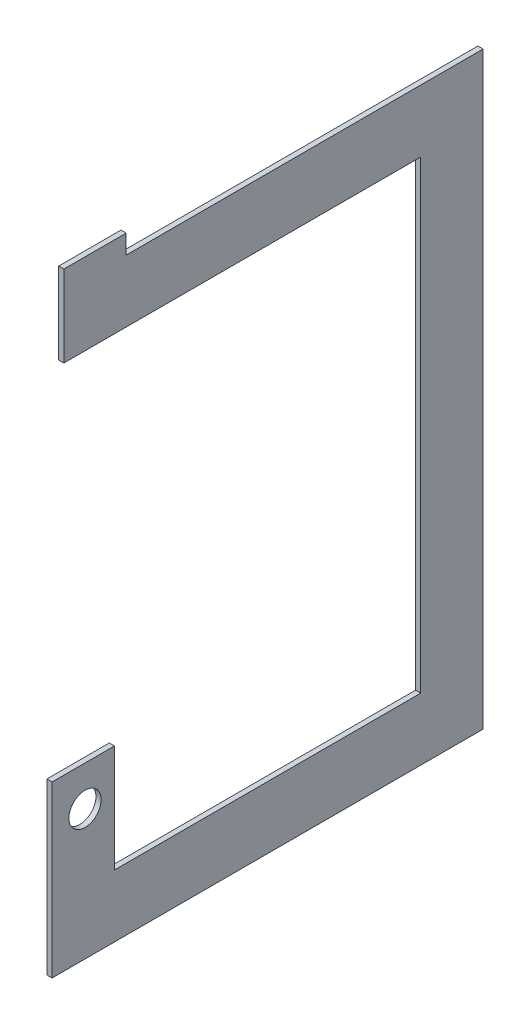
ISO-10303-21;
HEADER;
FILE_DESCRIPTION(('STEP AP214'),'2;1');
FILE_NAME('part.step','',(''),(''),'','','');
FILE_SCHEMA(('AUTOMOTIVE_DESIGN { 1 0 10303 214 1 1 1 1 }'));
ENDSEC;
DATA;
#1=APPLICATION_CONTEXT('core data for automotive mechanical design processes');
#2=APPLICATION_PROTOCOL_DEFINITION('international standard','automotive_design',2000,#1);
#3=PRODUCT_CONTEXT('',#1,'mechanical');
#4=PRODUCT('Part','Part','',(#3));
#5=PRODUCT_RELATED_PRODUCT_CATEGORY('part','',(#4));
#6=PRODUCT_DEFINITION_FORMATION('','',#4);
#7=PRODUCT_DEFINITION_CONTEXT('part definition',#1,'design');
#8=PRODUCT_DEFINITION('design','',#6,#7);
#9=PRODUCT_DEFINITION_SHAPE('','',#8);
#10=(LENGTH_UNIT() NAMED_UNIT(*) SI_UNIT(.MILLI.,.METRE.));
#11=(NAMED_UNIT(*) PLANE_ANGLE_UNIT() SI_UNIT($,.RADIAN.));
#12=(NAMED_UNIT(*) SI_UNIT($,.STERADIAN.) SOLID_ANGLE_UNIT());
#13=UNCERTAINTY_MEASURE_WITH_UNIT(LENGTH_MEASURE(1.E-05),#10,'distance_accuracy_value','');
#14=(GEOMETRIC_REPRESENTATION_CONTEXT(3) GLOBAL_UNCERTAINTY_ASSIGNED_CONTEXT((#13)) GLOBAL_UNIT_ASSIGNED_CONTEXT((#10,
#11,#12)) REPRESENTATION_CONTEXT('',''));
#15=CARTESIAN_POINT('',(0.,0.,0.));
#16=DIRECTION('',(0.,0.,1.));
#17=DIRECTION('',(1.,0.,0.));
#18=AXIS2_PLACEMENT_3D('',#15,#16,#17);
#19=CARTESIAN_POINT('',(0.3,0.,0.));
#20=DIRECTION('',(1.,0.,0.));
#21=DIRECTION('',(0.,0.,-1.));
#22=AXIS2_PLACEMENT_3D('',#19,#20,#21);
#23=PLANE('',#22);
#24=DIRECTION('',(0.,0.,1.));
#25=VECTOR('',#24,1.);
#26=CARTESIAN_POINT('',(0.3,0.,-3.6));
#27=LINE('',#26,#25);
#28=CARTESIAN_POINT('',(0.3,0.,-3.6));
#29=VERTEX_POINT('',#28);
#30=CARTESIAN_POINT('',(0.3,0.,0.));
#31=VERTEX_POINT('',#30);
#32=EDGE_CURVE('E200',#29,#31,#27,.T.);
#33=ORIENTED_EDGE('',*,*,#32,.T.);
#34=DIRECTION('',(0.,-1.,0.));
#35=VECTOR('',#34,1.);
#36=CARTESIAN_POINT('',(0.3,0.,0.));
#37=LINE('',#36,#35);
#38=CARTESIAN_POINT('',(0.3,-9.8,0.));
#39=VERTEX_POINT('',#38);
#40=EDGE_CURVE('E112',#31,#39,#37,.T.);
#41=ORIENTED_EDGE('',*,*,#40,.T.);
#42=DIRECTION('',(0.,0.,-1.));
#43=VECTOR('',#42,1.);
#44=CARTESIAN_POINT('',(0.3,-9.8,0.));
#45=LINE('',#44,#43);
#46=CARTESIAN_POINT('',(0.3,-9.8,-24.8771));
#47=VERTEX_POINT('',#46);
#48=EDGE_CURVE('E237',#39,#47,#45,.T.);
#49=ORIENTED_EDGE('',*,*,#48,.T.);
#50=DIRECTION('',(0.,1.,0.));
#51=VECTOR('',#50,1.);
#52=CARTESIAN_POINT('',(0.3,-9.8,-24.8771));
#53=LINE('',#52,#51);
#54=CARTESIAN_POINT('',(0.3,24.2,-24.8771));
#55=VERTEX_POINT('',#54);
#56=EDGE_CURVE('E257',#47,#55,#53,.T.);
#57=ORIENTED_EDGE('',*,*,#56,.T.);
#58=DIRECTION('',(0.,0.,1.));
#59=VECTOR('',#58,1.);
#60=CARTESIAN_POINT('',(0.3,24.2,-24.8771));
#61=LINE('',#60,#59);
#62=CARTESIAN_POINT('',(0.3,24.2,-4.2771));
#63=VERTEX_POINT('',#62);
#64=EDGE_CURVE('E253',#55,#63,#61,.T.);
#65=ORIENTED_EDGE('',*,*,#64,.T.);
#66=DIRECTION('',(0.,1.,0.));
#67=VECTOR('',#66,1.);
#68=CARTESIAN_POINT('',(0.3,24.2,-4.2771));
#69=LINE('',#68,#67);
#70=CARTESIAN_POINT('',(0.3,25.3,-4.2771));
#71=VERTEX_POINT('',#70);
#72=EDGE_CURVE('E256',#63,#71,#69,.T.);
#73=ORIENTED_EDGE('',*,*,#72,.T.);
#74=DIRECTION('',(0.,0.,1.));
#75=VECTOR('',#74,1.);
#76=CARTESIAN_POINT('',(0.3,25.3,-4.2771));
#77=LINE('',#76,#75);
#78=CARTESIAN_POINT('',(0.3,25.3,-0.6771));
#79=VERTEX_POINT('',#78);
#80=EDGE_CURVE('E261',#71,#79,#77,.T.);
#81=ORIENTED_EDGE('',*,*,#80,.T.);
#82=DIRECTION('',(0.,-1.,0.));
#83=VECTOR('',#82,1.);
#84=CARTESIAN_POINT('',(0.3,25.3,-0.6771));
#85=LINE('',#84,#83);
#86=CARTESIAN_POINT('',(0.3,20.6,-0.677100000000001));
#87=VERTEX_POINT('',#86);
#88=EDGE_CURVE('E268',#79,#87,#85,.T.);
#89=ORIENTED_EDGE('',*,*,#88,.T.);
#90=DIRECTION('',(0.,0.,-1.));
#91=VECTOR('',#90,1.);
#92=CARTESIAN_POINT('',(0.3,20.6,-0.677100000000001));
#93=LINE('',#92,#91);
#94=CARTESIAN_POINT('',(0.3,20.6,-21.2771));
#95=VERTEX_POINT('',#94);
#96=EDGE_CURVE('E143',#87,#95,#93,.T.);
#97=ORIENTED_EDGE('',*,*,#96,.T.);
#98=DIRECTION('',(0.,-1.,0.));
#99=VECTOR('',#98,1.);
#100=CARTESIAN_POINT('',(0.3,20.6,-21.2771));
#101=LINE('',#100,#99);
#102=CARTESIAN_POINT('',(0.3,-6.2,-21.2771));
#103=VERTEX_POINT('',#102);
#104=EDGE_CURVE('E137',#95,#103,#101,.T.);
#105=ORIENTED_EDGE('',*,*,#104,.T.);
#106=DIRECTION('',(0.,0.,1.));
#107=VECTOR('',#106,1.);
#108=CARTESIAN_POINT('',(0.3,-6.2,-21.2771));
#109=LINE('',#108,#107);
#110=CARTESIAN_POINT('',(0.3,-6.2,-3.6));
#111=VERTEX_POINT('',#110);
#112=EDGE_CURVE('E141',#103,#111,#109,.T.);
#113=ORIENTED_EDGE('',*,*,#112,.T.);
#114=DIRECTION('',(0.,1.,0.));
#115=VECTOR('',#114,1.);
#116=CARTESIAN_POINT('',(0.3,-6.2,-3.6));
#117=LINE('',#116,#115);
#118=EDGE_CURVE('E57',#111,#29,#117,.T.);
#119=ORIENTED_EDGE('',*,*,#118,.T.);
#120=EDGE_LOOP('',(#33,#41,#49,#57,#65,#73,#81,#89,#97,#105,#113,#119));
#121=FACE_BOUND('',#120,.T.);
#122=CARTESIAN_POINT('',(0.3,-2.295,-1.9));
#123=DIRECTION('',(1.,0.,0.));
#124=DIRECTION('',(0.,0.,-1.));
#125=AXIS2_PLACEMENT_3D('',#122,#123,#124);
#126=CIRCLE('',#125,0.93);
#127=CARTESIAN_POINT('',(0.3,-2.295,-2.83));
#128=VERTEX_POINT('',#127);
#129=EDGE_CURVE('E170',#128,#128,#126,.T.);
#130=ORIENTED_EDGE('',*,*,#129,.F.);
#131=EDGE_LOOP('',(#130));
#132=FACE_BOUND('',#131,.T.);
#133=ADVANCED_FACE('F39',(#121,#132),#23,.T.);
#134=CARTESIAN_POINT('',(0.,0.,0.));
#135=DIRECTION('',(1.,0.,0.));
#136=DIRECTION('',(0.,0.,-1.));
#137=AXIS2_PLACEMENT_3D('',#134,#135,#136);
#138=PLANE('',#137);
#139=DIRECTION('',(0.,0.,1.));
#140=VECTOR('',#139,1.);
#141=CARTESIAN_POINT('',(0.,0.,-3.6));
#142=LINE('',#141,#140);
#143=CARTESIAN_POINT('',(0.,0.,-3.6));
#144=VERTEX_POINT('',#143);
#145=CARTESIAN_POINT('',(0.,0.,0.));
#146=VERTEX_POINT('',#145);
#147=EDGE_CURVE('E165',#144,#146,#142,.T.);
#148=ORIENTED_EDGE('',*,*,#147,.F.);
#149=DIRECTION('',(0.,1.,0.));
#150=VECTOR('',#149,1.);
#151=CARTESIAN_POINT('',(0.,-6.2,-3.6));
#152=LINE('',#151,#150);
#153=CARTESIAN_POINT('',(0.,-6.2,-3.6));
#154=VERTEX_POINT('',#153);
#155=EDGE_CURVE('E104',#154,#144,#152,.T.);
#156=ORIENTED_EDGE('',*,*,#155,.F.);
#157=DIRECTION('',(0.,0.,1.));
#158=VECTOR('',#157,1.);
#159=CARTESIAN_POINT('',(0.,-6.2,-21.2771));
#160=LINE('',#159,#158);
#161=CARTESIAN_POINT('',(0.,-6.2,-21.2771));
#162=VERTEX_POINT('',#161);
#163=EDGE_CURVE('E98',#162,#154,#160,.T.);
#164=ORIENTED_EDGE('',*,*,#163,.F.);
#165=DIRECTION('',(0.,-1.,0.));
#166=VECTOR('',#165,1.);
#167=CARTESIAN_POINT('',(0.,20.6,-21.2771));
#168=LINE('',#167,#166);
#169=CARTESIAN_POINT('',(0.,20.6,-21.2771));
#170=VERTEX_POINT('',#169);
#171=EDGE_CURVE('E152',#170,#162,#168,.T.);
#172=ORIENTED_EDGE('',*,*,#171,.F.);
#173=DIRECTION('',(0.,0.,-1.));
#174=VECTOR('',#173,1.);
#175=CARTESIAN_POINT('',(0.,20.6,-0.677100000000001));
#176=LINE('',#175,#174);
#177=CARTESIAN_POINT('',(0.,20.6,-0.677100000000001));
#178=VERTEX_POINT('',#177);
#179=EDGE_CURVE('E191',#178,#170,#176,.T.);
#180=ORIENTED_EDGE('',*,*,#179,.F.);
#181=DIRECTION('',(0.,-1.,0.));
#182=VECTOR('',#181,1.);
#183=CARTESIAN_POINT('',(0.,25.3,-0.6771));
#184=LINE('',#183,#182);
#185=CARTESIAN_POINT('',(0.,25.3,-0.6771));
#186=VERTEX_POINT('',#185);
#187=EDGE_CURVE('E188',#186,#178,#184,.T.);
#188=ORIENTED_EDGE('',*,*,#187,.F.);
#189=DIRECTION('',(0.,0.,1.));
#190=VECTOR('',#189,1.);
#191=CARTESIAN_POINT('',(0.,25.3,-4.2771));
#192=LINE('',#191,#190);
#193=CARTESIAN_POINT('',(0.,25.3,-4.2771));
#194=VERTEX_POINT('',#193);
#195=EDGE_CURVE('E185',#194,#186,#192,.T.);
#196=ORIENTED_EDGE('',*,*,#195,.F.);
#197=DIRECTION('',(0.,1.,0.));
#198=VECTOR('',#197,1.);
#199=CARTESIAN_POINT('',(0.,24.2,-4.2771));
#200=LINE('',#199,#198);
#201=CARTESIAN_POINT('',(0.,24.2,-4.2771));
#202=VERTEX_POINT('',#201);
#203=EDGE_CURVE('E182',#202,#194,#200,.T.);
#204=ORIENTED_EDGE('',*,*,#203,.F.);
#205=DIRECTION('',(0.,0.,1.));
#206=VECTOR('',#205,1.);
#207=CARTESIAN_POINT('',(0.,24.2,-24.8771));
#208=LINE('',#207,#206);
#209=CARTESIAN_POINT('',(0.,24.2,-24.8771));
#210=VERTEX_POINT('',#209);
#211=EDGE_CURVE('E179',#210,#202,#208,.T.);
#212=ORIENTED_EDGE('',*,*,#211,.F.);
#213=DIRECTION('',(0.,1.,0.));
#214=VECTOR('',#213,1.);
#215=CARTESIAN_POINT('',(0.,-9.8,-24.8771));
#216=LINE('',#215,#214);
#217=CARTESIAN_POINT('',(0.,-9.8,-24.8771));
#218=VERTEX_POINT('',#217);
#219=EDGE_CURVE('E176',#218,#210,#216,.T.);
#220=ORIENTED_EDGE('',*,*,#219,.F.);
#221=DIRECTION('',(0.,0.,-1.));
#222=VECTOR('',#221,1.);
#223=CARTESIAN_POINT('',(0.,-9.8,0.));
#224=LINE('',#223,#222);
#225=CARTESIAN_POINT('',(0.,-9.8,0.));
#226=VERTEX_POINT('',#225);
#227=EDGE_CURVE('E173',#226,#218,#224,.T.);
#228=ORIENTED_EDGE('',*,*,#227,.F.);
#229=DIRECTION('',(0.,-1.,0.));
#230=VECTOR('',#229,1.);
#231=CARTESIAN_POINT('',(0.,0.,0.));
#232=LINE('',#231,#230);
#233=EDGE_CURVE('E169',#146,#226,#232,.T.);
#234=ORIENTED_EDGE('',*,*,#233,.F.);
#235=EDGE_LOOP('',(#148,#156,#164,#172,#180,#188,#196,#204,#212,#220,#228,#234));
#236=FACE_BOUND('',#235,.T.);
#237=CARTESIAN_POINT('',(0.,-2.295,-1.9));
#238=DIRECTION('',(1.,0.,0.));
#239=DIRECTION('',(0.,0.,-1.));
#240=AXIS2_PLACEMENT_3D('',#237,#238,#239);
#241=CIRCLE('',#240,0.93);
#242=CARTESIAN_POINT('',(0.,-2.295,-2.83));
#243=VERTEX_POINT('',#242);
#244=EDGE_CURVE('E417',#243,#243,#241,.T.);
#245=ORIENTED_EDGE('',*,*,#244,.T.);
#246=EDGE_LOOP('',(#245));
#247=FACE_BOUND('',#246,.T.);
#248=ADVANCED_FACE('F241',(#236,#247),#138,.F.);
#249=CARTESIAN_POINT('',(0.3,0.,-3.6));
#250=DIRECTION('',(0.,-1.,0.));
#251=DIRECTION('',(0.,0.,-1.));
#252=AXIS2_PLACEMENT_3D('',#249,#250,#251);
#253=PLANE('',#252);
#254=ORIENTED_EDGE('',*,*,#147,.T.);
#255=DIRECTION('',(-1.,0.,0.));
#256=VECTOR('',#255,1.);
#257=CARTESIAN_POINT('',(0.3,0.,0.));
#258=LINE('',#257,#256);
#259=EDGE_CURVE('E11',#31,#146,#258,.T.);
#260=ORIENTED_EDGE('',*,*,#259,.F.);
#261=ORIENTED_EDGE('',*,*,#32,.F.);
#262=DIRECTION('',(-1.,0.,0.));
#263=VECTOR('',#262,1.);
#264=CARTESIAN_POINT('',(0.3,0.,-3.6));
#265=LINE('',#264,#263);
#266=EDGE_CURVE('E161',#29,#144,#265,.T.);
#267=ORIENTED_EDGE('',*,*,#266,.T.);
#268=EDGE_LOOP('',(#254,#260,#261,#267));
#269=FACE_BOUND('',#268,.T.);
#270=ADVANCED_FACE('F41',(#269),#253,.F.);
#271=CARTESIAN_POINT('',(0.3,0.,0.));
#272=DIRECTION('',(0.,0.,-1.));
#273=DIRECTION('',(-1.,0.,0.));
#274=AXIS2_PLACEMENT_3D('',#271,#272,#273);
#275=PLANE('',#274);
#276=ORIENTED_EDGE('',*,*,#233,.T.);
#277=DIRECTION('',(-1.,0.,0.));
#278=VECTOR('',#277,1.);
#279=CARTESIAN_POINT('',(0.3,-9.8,0.));
#280=LINE('',#279,#278);
#281=EDGE_CURVE('E49',#39,#226,#280,.T.);
#282=ORIENTED_EDGE('',*,*,#281,.F.);
#283=ORIENTED_EDGE('',*,*,#40,.F.);
#284=ORIENTED_EDGE('',*,*,#259,.T.);
#285=EDGE_LOOP('',(#276,#282,#283,#284));
#286=FACE_BOUND('',#285,.T.);
#287=ADVANCED_FACE('F304',(#286),#275,.F.);
#288=CARTESIAN_POINT('',(0.3,-9.8,0.));
#289=DIRECTION('',(0.,1.,0.));
#290=DIRECTION('',(0.,0.,1.));
#291=AXIS2_PLACEMENT_3D('',#288,#289,#290);
#292=PLANE('',#291);
#293=ORIENTED_EDGE('',*,*,#227,.T.);
#294=DIRECTION('',(-1.,0.,0.));
#295=VECTOR('',#294,1.);
#296=CARTESIAN_POINT('',(0.3,-9.8,-24.8771));
#297=LINE('',#296,#295);
#298=EDGE_CURVE('E227',#47,#218,#297,.T.);
#299=ORIENTED_EDGE('',*,*,#298,.F.);
#300=ORIENTED_EDGE('',*,*,#48,.F.);
#301=ORIENTED_EDGE('',*,*,#281,.T.);
#302=EDGE_LOOP('',(#293,#299,#300,#301));
#303=FACE_BOUND('',#302,.T.);
#304=ADVANCED_FACE('F235',(#303),#292,.F.);
#305=CARTESIAN_POINT('',(0.3,-9.8,-24.8771));
#306=DIRECTION('',(0.,0.,1.));
#307=DIRECTION('',(1.,0.,0.));
#308=AXIS2_PLACEMENT_3D('',#305,#306,#307);
#309=PLANE('',#308);
#310=ORIENTED_EDGE('',*,*,#219,.T.);
#311=DIRECTION('',(-1.,0.,0.));
#312=VECTOR('',#311,1.);
#313=CARTESIAN_POINT('',(0.3,24.2,-24.8771));
#314=LINE('',#313,#312);
#315=EDGE_CURVE('E223',#55,#210,#314,.T.);
#316=ORIENTED_EDGE('',*,*,#315,.F.);
#317=ORIENTED_EDGE('',*,*,#56,.F.);
#318=ORIENTED_EDGE('',*,*,#298,.T.);
#319=EDGE_LOOP('',(#310,#316,#317,#318));
#320=FACE_BOUND('',#319,.T.);
#321=ADVANCED_FACE('F247',(#320),#309,.F.);
#322=CARTESIAN_POINT('',(0.3,24.2,-24.8771));
#323=DIRECTION('',(0.,-1.,0.));
#324=DIRECTION('',(0.,0.,-1.));
#325=AXIS2_PLACEMENT_3D('',#322,#323,#324);
#326=PLANE('',#325);
#327=ORIENTED_EDGE('',*,*,#211,.T.);
#328=DIRECTION('',(-1.,0.,0.));
#329=VECTOR('',#328,1.);
#330=CARTESIAN_POINT('',(0.3,24.2,-4.2771));
#331=LINE('',#330,#329);
#332=EDGE_CURVE('E219',#63,#202,#331,.T.);
#333=ORIENTED_EDGE('',*,*,#332,.F.);
#334=ORIENTED_EDGE('',*,*,#64,.F.);
#335=ORIENTED_EDGE('',*,*,#315,.T.);
#336=EDGE_LOOP('',(#327,#333,#334,#335));
#337=FACE_BOUND('',#336,.T.);
#338=ADVANCED_FACE('F251',(#337),#326,.F.);
#339=CARTESIAN_POINT('',(0.3,24.2,-4.2771));
#340=DIRECTION('',(0.,0.,1.));
#341=DIRECTION('',(1.,0.,0.));
#342=AXIS2_PLACEMENT_3D('',#339,#340,#341);
#343=PLANE('',#342);
#344=ORIENTED_EDGE('',*,*,#203,.T.);
#345=DIRECTION('',(-1.,0.,0.));
#346=VECTOR('',#345,1.);
#347=CARTESIAN_POINT('',(0.3,25.3,-4.2771));
#348=LINE('',#347,#346);
#349=EDGE_CURVE('E215',#71,#194,#348,.T.);
#350=ORIENTED_EDGE('',*,*,#349,.F.);
#351=ORIENTED_EDGE('',*,*,#72,.F.);
#352=ORIENTED_EDGE('',*,*,#332,.T.);
#353=EDGE_LOOP('',(#344,#350,#351,#352));
#354=FACE_BOUND('',#353,.T.);
#355=ADVANCED_FACE('F317',(#354),#343,.F.);
#356=CARTESIAN_POINT('',(0.3,25.3,-4.2771));
#357=DIRECTION('',(0.,-1.,0.));
#358=DIRECTION('',(0.,0.,-1.));
#359=AXIS2_PLACEMENT_3D('',#356,#357,#358);
#360=PLANE('',#359);
#361=ORIENTED_EDGE('',*,*,#195,.T.);
#362=DIRECTION('',(-1.,0.,0.));
#363=VECTOR('',#362,1.);
#364=CARTESIAN_POINT('',(0.3,25.3,-0.6771));
#365=LINE('',#364,#363);
#366=EDGE_CURVE('E211',#79,#186,#365,.T.);
#367=ORIENTED_EDGE('',*,*,#366,.F.);
#368=ORIENTED_EDGE('',*,*,#80,.F.);
#369=ORIENTED_EDGE('',*,*,#349,.T.);
#370=EDGE_LOOP('',(#361,#367,#368,#369));
#371=FACE_BOUND('',#370,.T.);
#372=ADVANCED_FACE('F320',(#371),#360,.F.);
#373=CARTESIAN_POINT('',(0.3,25.3,-0.6771));
#374=DIRECTION('',(0.,0.,-1.));
#375=DIRECTION('',(0.,1.,0.));
#376=AXIS2_PLACEMENT_3D('',#373,#374,#375);
#377=PLANE('',#376);
#378=ORIENTED_EDGE('',*,*,#187,.T.);
#379=DIRECTION('',(-1.,0.,0.));
#380=VECTOR('',#379,1.);
#381=CARTESIAN_POINT('',(0.3,20.6,-0.677100000000001));
#382=LINE('',#381,#380);
#383=EDGE_CURVE('E207',#87,#178,#382,.T.);
#384=ORIENTED_EDGE('',*,*,#383,.F.);
#385=ORIENTED_EDGE('',*,*,#88,.F.);
#386=ORIENTED_EDGE('',*,*,#366,.T.);
#387=EDGE_LOOP('',(#378,#384,#385,#386));
#388=FACE_BOUND('',#387,.T.);
#389=ADVANCED_FACE('F276',(#388),#377,.F.);
#390=CARTESIAN_POINT('',(0.3,20.6,-0.677100000000001));
#391=DIRECTION('',(0.,1.,0.));
#392=DIRECTION('',(0.,0.,1.));
#393=AXIS2_PLACEMENT_3D('',#390,#391,#392);
#394=PLANE('',#393);
#395=ORIENTED_EDGE('',*,*,#179,.T.);
#396=DIRECTION('',(-1.,0.,0.));
#397=VECTOR('',#396,1.);
#398=CARTESIAN_POINT('',(0.3,20.6,-21.2771));
#399=LINE('',#398,#397);
#400=EDGE_CURVE('E154',#95,#170,#399,.T.);
#401=ORIENTED_EDGE('',*,*,#400,.F.);
#402=ORIENTED_EDGE('',*,*,#96,.F.);
#403=ORIENTED_EDGE('',*,*,#383,.T.);
#404=EDGE_LOOP('',(#395,#401,#402,#403));
#405=FACE_BOUND('',#404,.T.);
#406=ADVANCED_FACE('F280',(#405),#394,.F.);
#407=CARTESIAN_POINT('',(0.3,20.6,-21.2771));
#408=DIRECTION('',(0.,0.,-1.));
#409=DIRECTION('',(0.,1.,0.));
#410=AXIS2_PLACEMENT_3D('',#407,#408,#409);
#411=PLANE('',#410);
#412=ORIENTED_EDGE('',*,*,#171,.T.);
#413=DIRECTION('',(-1.,0.,0.));
#414=VECTOR('',#413,1.);
#415=CARTESIAN_POINT('',(0.3,-6.2,-21.2771));
#416=LINE('',#415,#414);
#417=EDGE_CURVE('E149',#103,#162,#416,.T.);
#418=ORIENTED_EDGE('',*,*,#417,.F.);
#419=ORIENTED_EDGE('',*,*,#104,.F.);
#420=ORIENTED_EDGE('',*,*,#400,.T.);
#421=EDGE_LOOP('',(#412,#418,#419,#420));
#422=FACE_BOUND('',#421,.T.);
#423=ADVANCED_FACE('F150',(#422),#411,.F.);
#424=CARTESIAN_POINT('',(0.3,-6.2,-21.2771));
#425=DIRECTION('',(0.,-1.,0.));
#426=DIRECTION('',(0.,0.,-1.));
#427=AXIS2_PLACEMENT_3D('',#424,#425,#426);
#428=PLANE('',#427);
#429=ORIENTED_EDGE('',*,*,#163,.T.);
#430=DIRECTION('',(-1.,0.,0.));
#431=VECTOR('',#430,1.);
#432=CARTESIAN_POINT('',(0.3,-6.2,-3.6));
#433=LINE('',#432,#431);
#434=EDGE_CURVE('E155',#111,#154,#433,.T.);
#435=ORIENTED_EDGE('',*,*,#434,.F.);
#436=ORIENTED_EDGE('',*,*,#112,.F.);
#437=ORIENTED_EDGE('',*,*,#417,.T.);
#438=EDGE_LOOP('',(#429,#435,#436,#437));
#439=FACE_BOUND('',#438,.T.);
#440=ADVANCED_FACE('F157',(#439),#428,.F.);
#441=CARTESIAN_POINT('',(0.3,-6.2,-3.6));
#442=DIRECTION('',(0.,0.,1.));
#443=DIRECTION('',(1.,0.,0.));
#444=AXIS2_PLACEMENT_3D('',#441,#442,#443);
#445=PLANE('',#444);
#446=ORIENTED_EDGE('',*,*,#155,.T.);
#447=ORIENTED_EDGE('',*,*,#266,.F.);
#448=ORIENTED_EDGE('',*,*,#118,.F.);
#449=ORIENTED_EDGE('',*,*,#434,.T.);
#450=EDGE_LOOP('',(#446,#447,#448,#449));
#451=FACE_BOUND('',#450,.T.);
#452=ADVANCED_FACE('F284',(#451),#445,.F.);
#453=CARTESIAN_POINT('',(0.3,-2.295,-1.9));
#454=DIRECTION('',(-1.,0.,0.));
#455=DIRECTION('',(0.,0.,1.));
#456=AXIS2_PLACEMENT_3D('',#453,#454,#455);
#457=CYLINDRICAL_SURFACE('',#456,0.93);
#458=ORIENTED_EDGE('',*,*,#129,.T.);
#459=EDGE_LOOP('',(#458));
#460=FACE_BOUND('',#459,.T.);
#461=ORIENTED_EDGE('',*,*,#244,.F.);
#462=EDGE_LOOP('',(#461));
#463=FACE_BOUND('',#462,.T.);
#464=ADVANCED_FACE('F286',(#460,#463),#457,.F.);
#465=CLOSED_SHELL('',(#133,#248,#270,#287,#304,#321,#338,#355,#372,#389,#406,#423,#440,#452,#464));
#466=MANIFOLD_SOLID_BREP('B2',#465);
#467=ADVANCED_BREP_SHAPE_REPRESENTATION('',(#18,#466),#14);
#468=SHAPE_DEFINITION_REPRESENTATION(#9,#467);
ENDSEC;
END-ISO-10303-21;
